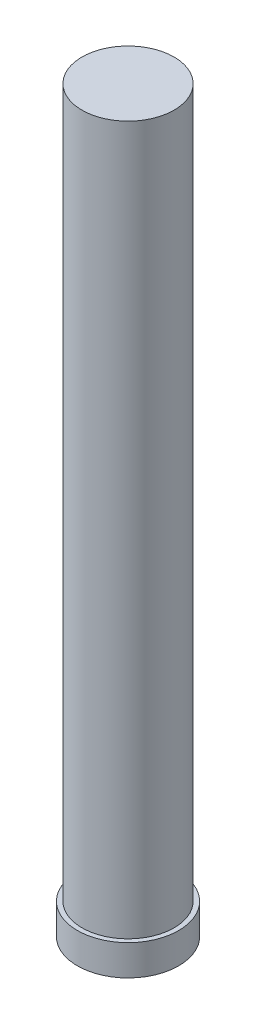
ISO-10303-21;
HEADER;
FILE_DESCRIPTION(('STEP AP214'),'2;1');
FILE_NAME('part.step','',(''),(''),'','','');
FILE_SCHEMA(('AUTOMOTIVE_DESIGN { 1 0 10303 214 1 1 1 1 }'));
ENDSEC;
DATA;
#1=APPLICATION_CONTEXT('core data for automotive mechanical design processes');
#2=APPLICATION_PROTOCOL_DEFINITION('international standard','automotive_design',2000,#1);
#3=PRODUCT_CONTEXT('',#1,'mechanical');
#4=PRODUCT('Part','Part','',(#3));
#5=PRODUCT_RELATED_PRODUCT_CATEGORY('part','',(#4));
#6=PRODUCT_DEFINITION_FORMATION('','',#4);
#7=PRODUCT_DEFINITION_CONTEXT('part definition',#1,'design');
#8=PRODUCT_DEFINITION('design','',#6,#7);
#9=PRODUCT_DEFINITION_SHAPE('','',#8);
#10=(LENGTH_UNIT() NAMED_UNIT(*) SI_UNIT(.MILLI.,.METRE.));
#11=(NAMED_UNIT(*) PLANE_ANGLE_UNIT() SI_UNIT($,.RADIAN.));
#12=(NAMED_UNIT(*) SI_UNIT($,.STERADIAN.) SOLID_ANGLE_UNIT());
#13=UNCERTAINTY_MEASURE_WITH_UNIT(LENGTH_MEASURE(1.E-05),#10,'distance_accuracy_value','');
#14=(GEOMETRIC_REPRESENTATION_CONTEXT(3) GLOBAL_UNCERTAINTY_ASSIGNED_CONTEXT((#13)) GLOBAL_UNIT_ASSIGNED_CONTEXT((#10,
#11,#12)) REPRESENTATION_CONTEXT('',''));
#15=CARTESIAN_POINT('',(0.,0.,0.));
#16=DIRECTION('',(0.,0.,1.));
#17=DIRECTION('',(1.,0.,0.));
#18=AXIS2_PLACEMENT_3D('',#15,#16,#17);
#19=CARTESIAN_POINT('',(0.,31.2351244723639,327.61692650334));
#20=DIRECTION('',(0.,1.,0.));
#21=DIRECTION('',(0.,0.,1.));
#22=AXIS2_PLACEMENT_3D('',#19,#20,#21);
#23=PLANE('',#22);
#24=CARTESIAN_POINT('',(0.,31.2351244723639,377.61692650334));
#25=DIRECTION('',(0.,-1.,0.));
#26=DIRECTION('',(0.,0.,-1.));
#27=AXIS2_PLACEMENT_3D('',#24,#25,#26);
#28=CIRCLE('',#27,50.);
#29=CARTESIAN_POINT('',(0.,31.2351244723639,327.61692650334));
#30=VERTEX_POINT('',#29);
#31=EDGE_CURVE('E46',#30,#30,#28,.T.);
#32=ORIENTED_EDGE('',*,*,#31,.T.);
#33=EDGE_LOOP('',(#32));
#34=FACE_BOUND('',#33,.T.);
#35=CARTESIAN_POINT('',(0.,31.2351244723639,377.61692650334));
#36=DIRECTION('',(0.,-1.,0.));
#37=DIRECTION('',(0.,0.,-1.));
#38=AXIS2_PLACEMENT_3D('',#35,#36,#37);
#39=CIRCLE('',#38,55.);
#40=CARTESIAN_POINT('',(0.,31.2351244723639,322.61692650334));
#41=VERTEX_POINT('',#40);
#42=EDGE_CURVE('E51',#41,#41,#39,.T.);
#43=ORIENTED_EDGE('',*,*,#42,.F.);
#44=EDGE_LOOP('',(#43));
#45=FACE_BOUND('',#44,.T.);
#46=ADVANCED_FACE('F38',(#34,#45),#23,.T.);
#47=CARTESIAN_POINT('',(0.,-5.62469756094575,377.61692650334));
#48=DIRECTION('',(0.,-1.,0.));
#49=DIRECTION('',(0.,0.,-1.));
#50=AXIS2_PLACEMENT_3D('',#47,#48,#49);
#51=CYLINDRICAL_SURFACE('',#50,55.);
#52=ORIENTED_EDGE('',*,*,#42,.T.);
#53=EDGE_LOOP('',(#52));
#54=FACE_BOUND('',#53,.T.);
#55=CARTESIAN_POINT('',(0.,-1.99924063583598,377.61692650334));
#56=DIRECTION('',(0.,-1.,0.));
#57=DIRECTION('',(0.,0.,-1.));
#58=AXIS2_PLACEMENT_3D('',#55,#56,#57);
#59=CIRCLE('',#58,55.);
#60=CARTESIAN_POINT('',(0.,-1.99924063583598,322.61692650334));
#61=VERTEX_POINT('',#60);
#62=EDGE_CURVE('E56',#61,#61,#59,.T.);
#63=ORIENTED_EDGE('',*,*,#62,.F.);
#64=EDGE_LOOP('',(#63));
#65=FACE_BOUND('',#64,.T.);
#66=ADVANCED_FACE('F65',(#54,#65),#51,.T.);
#67=CARTESIAN_POINT('',(0.,-1.99924063583599,322.61692650334));
#68=DIRECTION('',(0.,-1.,0.));
#69=DIRECTION('',(0.,0.,-1.));
#70=AXIS2_PLACEMENT_3D('',#67,#68,#69);
#71=PLANE('',#70);
#72=ORIENTED_EDGE('',*,*,#62,.T.);
#73=EDGE_LOOP('',(#72));
#74=FACE_BOUND('',#73,.T.);
#75=ADVANCED_FACE('F63',(#74),#71,.T.);
#76=CARTESIAN_POINT('',(0.,-122.49443207127,377.61692650334));
#77=DIRECTION('',(0.,-1.,0.));
#78=DIRECTION('',(0.,0.,-1.));
#79=AXIS2_PLACEMENT_3D('',#76,#77,#78);
#80=CYLINDRICAL_SURFACE('',#79,50.);
#81=ORIENTED_EDGE('',*,*,#31,.F.);
#82=EDGE_LOOP('',(#81));
#83=FACE_BOUND('',#82,.T.);
#84=CARTESIAN_POINT('',(0.,800.,377.61692650334));
#85=DIRECTION('',(0.,-1.,0.));
#86=DIRECTION('',(0.,0.,-1.));
#87=AXIS2_PLACEMENT_3D('',#84,#85,#86);
#88=CIRCLE('',#87,50.);
#89=CARTESIAN_POINT('',(0.,800.,327.61692650334));
#90=VERTEX_POINT('',#89);
#91=EDGE_CURVE('E10',#90,#90,#88,.T.);
#92=ORIENTED_EDGE('',*,*,#91,.T.);
#93=EDGE_LOOP('',(#92));
#94=FACE_BOUND('',#93,.T.);
#95=ADVANCED_FACE('F40',(#83,#94),#80,.T.);
#96=CARTESIAN_POINT('',(0.,800.,427.61692650334));
#97=DIRECTION('',(0.,-1.,0.));
#98=DIRECTION('',(0.,0.,-1.));
#99=AXIS2_PLACEMENT_3D('',#96,#97,#98);
#100=PLANE('',#99);
#101=ORIENTED_EDGE('',*,*,#91,.F.);
#102=EDGE_LOOP('',(#101));
#103=FACE_BOUND('',#102,.T.);
#104=ADVANCED_FACE('F75',(#103),#100,.F.);
#105=CLOSED_SHELL('',(#46,#66,#75,#95,#104));
#106=MANIFOLD_SOLID_BREP('B2',#105);
#107=ADVANCED_BREP_SHAPE_REPRESENTATION('',(#18,#106),#14);
#108=SHAPE_DEFINITION_REPRESENTATION(#9,#107);
ENDSEC;
END-ISO-10303-21;
